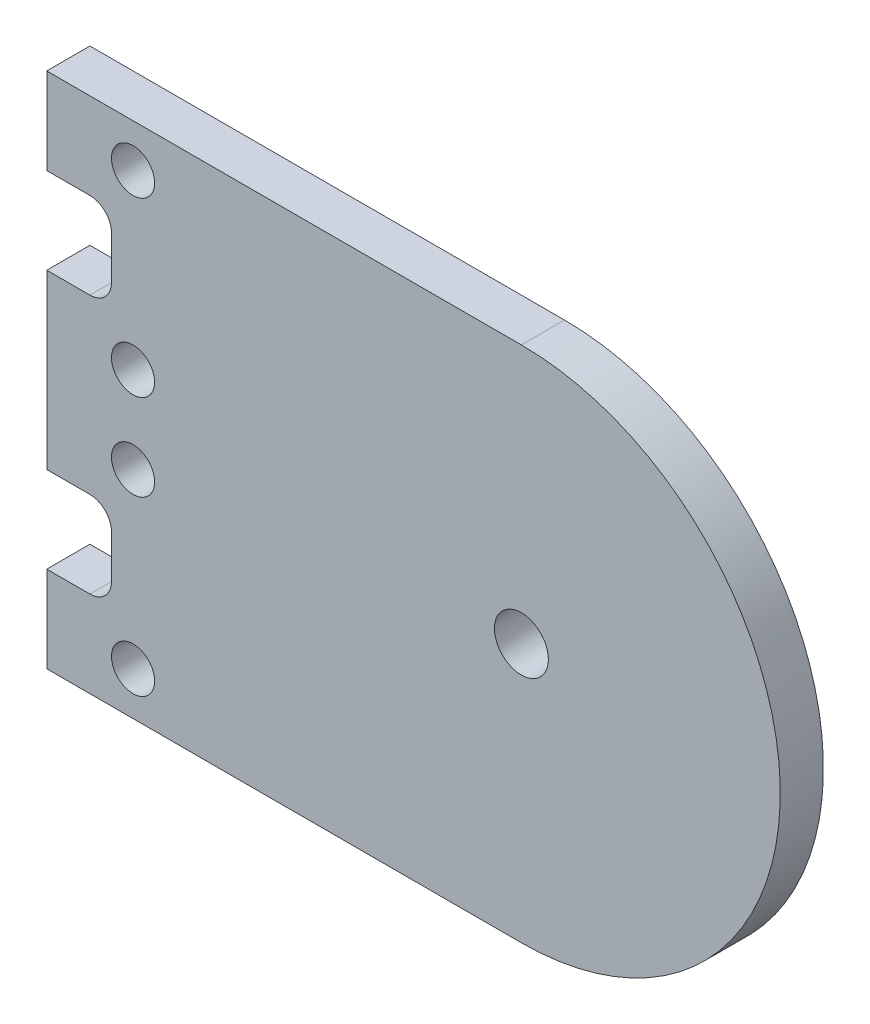
ISO-10303-21;
HEADER;
FILE_DESCRIPTION(('STEP AP214'),'2;1');
FILE_NAME('part.step','',(''),(''),'','','');
FILE_SCHEMA(('AUTOMOTIVE_DESIGN { 1 0 10303 214 1 1 1 1 }'));
ENDSEC;
DATA;
#1=APPLICATION_CONTEXT('core data for automotive mechanical design processes');
#2=APPLICATION_PROTOCOL_DEFINITION('international standard','automotive_design',2000,#1);
#3=PRODUCT_CONTEXT('',#1,'mechanical');
#4=PRODUCT('Part','Part','',(#3));
#5=PRODUCT_RELATED_PRODUCT_CATEGORY('part','',(#4));
#6=PRODUCT_DEFINITION_FORMATION('','',#4);
#7=PRODUCT_DEFINITION_CONTEXT('part definition',#1,'design');
#8=PRODUCT_DEFINITION('design','',#6,#7);
#9=PRODUCT_DEFINITION_SHAPE('','',#8);
#10=(LENGTH_UNIT() NAMED_UNIT(*) SI_UNIT(.MILLI.,.METRE.));
#11=(NAMED_UNIT(*) PLANE_ANGLE_UNIT() SI_UNIT($,.RADIAN.));
#12=(NAMED_UNIT(*) SI_UNIT($,.STERADIAN.) SOLID_ANGLE_UNIT());
#13=UNCERTAINTY_MEASURE_WITH_UNIT(LENGTH_MEASURE(1.E-05),#10,'distance_accuracy_value','');
#14=(GEOMETRIC_REPRESENTATION_CONTEXT(3) GLOBAL_UNCERTAINTY_ASSIGNED_CONTEXT((#13)) GLOBAL_UNIT_ASSIGNED_CONTEXT((#10,
#11,#12)) REPRESENTATION_CONTEXT('',''));
#15=CARTESIAN_POINT('',(0.,0.,0.));
#16=DIRECTION('',(0.,0.,1.));
#17=DIRECTION('',(1.,0.,0.));
#18=AXIS2_PLACEMENT_3D('',#15,#16,#17);
#19=CARTESIAN_POINT('',(-36.0930614932367,8.87902554185879,2.));
#20=DIRECTION('',(0.,0.,-1.));
#21=DIRECTION('',(-1.,0.,0.));
#22=AXIS2_PLACEMENT_3D('',#19,#20,#21);
#23=PLANE('',#22);
#24=DIRECTION('',(0.,-1.,0.));
#25=VECTOR('',#24,1.);
#26=CARTESIAN_POINT('',(-38.0930614932367,13.8790255418588,2.));
#27=LINE('',#26,#25);
#28=CARTESIAN_POINT('',(-38.0930614932367,13.8790255418588,2.));
#29=VERTEX_POINT('',#28);
#30=CARTESIAN_POINT('',(-38.0930614932367,9.87902554185879,2.));
#31=VERTEX_POINT('',#30);
#32=EDGE_CURVE('E208',#29,#31,#27,.T.);
#33=ORIENTED_EDGE('',*,*,#32,.T.);
#34=DIRECTION('',(1.,0.,0.));
#35=VECTOR('',#34,1.);
#36=CARTESIAN_POINT('',(-38.0930614932367,9.87902554185879,2.));
#37=LINE('',#36,#35);
#38=CARTESIAN_POINT('',(-36.0930614932367,9.87902554185879,2.));
#39=VERTEX_POINT('',#38);
#40=EDGE_CURVE('E116',#31,#39,#37,.T.);
#41=ORIENTED_EDGE('',*,*,#40,.T.);
#42=CARTESIAN_POINT('',(-36.0930614932367,8.87902554185879,2.));
#43=DIRECTION('',(0.,0.,-1.));
#44=DIRECTION('',(-1.,0.,0.));
#45=AXIS2_PLACEMENT_3D('',#42,#43,#44);
#46=CIRCLE('',#45,1.);
#47=CARTESIAN_POINT('',(-35.0930614932367,8.87902554185879,2.));
#48=VERTEX_POINT('',#47);
#49=EDGE_CURVE('E247',#39,#48,#46,.T.);
#50=ORIENTED_EDGE('',*,*,#49,.T.);
#51=DIRECTION('',(0.,-1.,0.));
#52=VECTOR('',#51,1.);
#53=CARTESIAN_POINT('',(-35.0930614932367,8.87902554185879,2.));
#54=LINE('',#53,#52);
#55=CARTESIAN_POINT('',(-35.0930614932367,6.87902554185879,2.));
#56=VERTEX_POINT('',#55);
#57=EDGE_CURVE('E266',#48,#56,#54,.T.);
#58=ORIENTED_EDGE('',*,*,#57,.T.);
#59=CARTESIAN_POINT('',(-36.0930614932367,6.87902554185879,2.));
#60=DIRECTION('',(0.,0.,-1.));
#61=DIRECTION('',(-1.,0.,0.));
#62=AXIS2_PLACEMENT_3D('',#59,#60,#61);
#63=CIRCLE('',#62,1.);
#64=CARTESIAN_POINT('',(-36.0930614932367,5.87902554185879,2.));
#65=VERTEX_POINT('',#64);
#66=EDGE_CURVE('E263',#56,#65,#63,.T.);
#67=ORIENTED_EDGE('',*,*,#66,.T.);
#68=DIRECTION('',(-1.,0.,0.));
#69=VECTOR('',#68,1.);
#70=CARTESIAN_POINT('',(-36.0930614932367,5.87902554185879,2.));
#71=LINE('',#70,#69);
#72=CARTESIAN_POINT('',(-38.0930614932367,5.87902554185879,2.));
#73=VERTEX_POINT('',#72);
#74=EDGE_CURVE('E265',#65,#73,#71,.T.);
#75=ORIENTED_EDGE('',*,*,#74,.T.);
#76=DIRECTION('',(0.,-1.,0.));
#77=VECTOR('',#76,1.);
#78=CARTESIAN_POINT('',(-38.0930614932367,5.87902554185879,2.));
#79=LINE('',#78,#77);
#80=CARTESIAN_POINT('',(-38.0930614932367,-2.12097445814121,2.));
#81=VERTEX_POINT('',#80);
#82=EDGE_CURVE('E268',#73,#81,#79,.T.);
#83=ORIENTED_EDGE('',*,*,#82,.T.);
#84=DIRECTION('',(1.,0.,0.));
#85=VECTOR('',#84,1.);
#86=CARTESIAN_POINT('',(-36.0930614932367,-2.12097445814121,2.));
#87=LINE('',#86,#85);
#88=CARTESIAN_POINT('',(-36.0930614932367,-2.12097445814121,2.));
#89=VERTEX_POINT('',#88);
#90=EDGE_CURVE('E274',#81,#89,#87,.T.);
#91=ORIENTED_EDGE('',*,*,#90,.T.);
#92=CARTESIAN_POINT('',(-36.0930614932367,-3.12097445814121,2.));
#93=DIRECTION('',(0.,0.,-1.));
#94=DIRECTION('',(1.,0.,0.));
#95=AXIS2_PLACEMENT_3D('',#92,#93,#94);
#96=CIRCLE('',#95,1.);
#97=CARTESIAN_POINT('',(-35.0930614932367,-3.12097445814121,2.));
#98=VERTEX_POINT('',#97);
#99=EDGE_CURVE('E276',#89,#98,#96,.T.);
#100=ORIENTED_EDGE('',*,*,#99,.T.);
#101=DIRECTION('',(0.,-1.,0.));
#102=VECTOR('',#101,1.);
#103=CARTESIAN_POINT('',(-35.0930614932367,-5.12097445814121,2.));
#104=LINE('',#103,#102);
#105=CARTESIAN_POINT('',(-35.0930614932367,-5.12097445814121,2.));
#106=VERTEX_POINT('',#105);
#107=EDGE_CURVE('E278',#98,#106,#104,.T.);
#108=ORIENTED_EDGE('',*,*,#107,.T.);
#109=CARTESIAN_POINT('',(-36.0930614932367,-5.12097445814121,2.));
#110=DIRECTION('',(0.,0.,-1.));
#111=DIRECTION('',(1.,0.,0.));
#112=AXIS2_PLACEMENT_3D('',#109,#110,#111);
#113=CIRCLE('',#112,1.);
#114=CARTESIAN_POINT('',(-36.0930614932367,-6.12097445814121,2.));
#115=VERTEX_POINT('',#114);
#116=EDGE_CURVE('E280',#106,#115,#113,.T.);
#117=ORIENTED_EDGE('',*,*,#116,.T.);
#118=DIRECTION('',(-1.,0.,0.));
#119=VECTOR('',#118,1.);
#120=CARTESIAN_POINT('',(-38.0930614932367,-6.12097445814121,2.));
#121=LINE('',#120,#119);
#122=CARTESIAN_POINT('',(-38.0930614932367,-6.12097445814121,2.));
#123=VERTEX_POINT('',#122);
#124=EDGE_CURVE('E282',#115,#123,#121,.T.);
#125=ORIENTED_EDGE('',*,*,#124,.T.);
#126=DIRECTION('',(0.,-1.,0.));
#127=VECTOR('',#126,1.);
#128=CARTESIAN_POINT('',(-38.0930614932367,-6.12097445814121,2.));
#129=LINE('',#128,#127);
#130=CARTESIAN_POINT('',(-38.0930614932367,-10.1209744581412,2.));
#131=VERTEX_POINT('',#130);
#132=EDGE_CURVE('E159',#123,#131,#129,.T.);
#133=ORIENTED_EDGE('',*,*,#132,.T.);
#134=DIRECTION('',(1.,0.,0.));
#135=VECTOR('',#134,1.);
#136=CARTESIAN_POINT('',(-38.0930614932367,-10.1209744581412,2.));
#137=LINE('',#136,#135);
#138=CARTESIAN_POINT('',(-16.0930614932367,-10.1209744581412,2.));
#139=VERTEX_POINT('',#138);
#140=EDGE_CURVE('E153',#131,#139,#137,.T.);
#141=ORIENTED_EDGE('',*,*,#140,.T.);
#142=CARTESIAN_POINT('',(-16.0930614932367,1.87902554185879,2.));
#143=DIRECTION('',(0.,0.,1.));
#144=DIRECTION('',(1.,0.,0.));
#145=AXIS2_PLACEMENT_3D('',#142,#143,#144);
#146=CIRCLE('',#145,12.);
#147=CARTESIAN_POINT('',(-16.0930614932367,13.8790255418588,2.));
#148=VERTEX_POINT('',#147);
#149=EDGE_CURVE('E157',#139,#148,#146,.T.);
#150=ORIENTED_EDGE('',*,*,#149,.T.);
#151=DIRECTION('',(-1.,0.,0.));
#152=VECTOR('',#151,1.);
#153=CARTESIAN_POINT('',(-38.0930614932367,13.8790255418588,2.));
#154=LINE('',#153,#152);
#155=EDGE_CURVE('E49',#148,#29,#154,.T.);
#156=ORIENTED_EDGE('',*,*,#155,.T.);
#157=EDGE_LOOP('',(#33,#41,#50,#58,#67,#75,#83,#91,#100,#108,#117,#125,#133,#141,#150,#156));
#158=FACE_BOUND('',#157,.T.);
#159=CARTESIAN_POINT('',(-16.0930614932367,1.87902554185879,2.));
#160=DIRECTION('',(0.,0.,1.));
#161=DIRECTION('',(1.,0.,0.));
#162=AXIS2_PLACEMENT_3D('',#159,#160,#161);
#163=CIRCLE('',#162,1.25);
#164=CARTESIAN_POINT('',(-14.8430614932367,1.87902554185879,2.));
#165=VERTEX_POINT('',#164);
#166=EDGE_CURVE('E181',#165,#165,#163,.T.);
#167=ORIENTED_EDGE('',*,*,#166,.F.);
#168=EDGE_LOOP('',(#167));
#169=FACE_BOUND('',#168,.T.);
#170=CARTESIAN_POINT('',(-34.0930614932367,11.8790255418588,2.));
#171=DIRECTION('',(0.,0.,1.));
#172=DIRECTION('',(1.,0.,0.));
#173=AXIS2_PLACEMENT_3D('',#170,#171,#172);
#174=CIRCLE('',#173,0.999999999999998);
#175=CARTESIAN_POINT('',(-33.0930614932367,11.8790255418588,2.));
#176=VERTEX_POINT('',#175);
#177=EDGE_CURVE('E356',#176,#176,#174,.T.);
#178=ORIENTED_EDGE('',*,*,#177,.F.);
#179=EDGE_LOOP('',(#178));
#180=FACE_BOUND('',#179,.T.);
#181=CARTESIAN_POINT('',(-34.0930614932367,3.87902554185879,2.));
#182=DIRECTION('',(0.,0.,1.));
#183=DIRECTION('',(1.,0.,0.));
#184=AXIS2_PLACEMENT_3D('',#181,#182,#183);
#185=CIRCLE('',#184,0.999999999999998);
#186=CARTESIAN_POINT('',(-33.0930614932367,3.87902554185879,2.));
#187=VERTEX_POINT('',#186);
#188=EDGE_CURVE('E350',#187,#187,#185,.T.);
#189=ORIENTED_EDGE('',*,*,#188,.F.);
#190=EDGE_LOOP('',(#189));
#191=FACE_BOUND('',#190,.T.);
#192=CARTESIAN_POINT('',(-34.0930614932367,-0.120974458141214,2.));
#193=DIRECTION('',(0.,0.,1.));
#194=DIRECTION('',(1.,0.,0.));
#195=AXIS2_PLACEMENT_3D('',#192,#193,#194);
#196=CIRCLE('',#195,0.999999999999998);
#197=CARTESIAN_POINT('',(-33.0930614932367,-0.120974458141214,2.));
#198=VERTEX_POINT('',#197);
#199=EDGE_CURVE('E344',#198,#198,#196,.T.);
#200=ORIENTED_EDGE('',*,*,#199,.F.);
#201=EDGE_LOOP('',(#200));
#202=FACE_BOUND('',#201,.T.);
#203=CARTESIAN_POINT('',(-34.0930614932367,-8.12097445814121,2.));
#204=DIRECTION('',(0.,0.,1.));
#205=DIRECTION('',(1.,0.,0.));
#206=AXIS2_PLACEMENT_3D('',#203,#204,#205);
#207=CIRCLE('',#206,0.999999999999998);
#208=CARTESIAN_POINT('',(-33.0930614932367,-8.12097445814121,2.));
#209=VERTEX_POINT('',#208);
#210=EDGE_CURVE('E335',#209,#209,#207,.T.);
#211=ORIENTED_EDGE('',*,*,#210,.F.);
#212=EDGE_LOOP('',(#211));
#213=FACE_BOUND('',#212,.T.);
#214=ADVANCED_FACE('F32',(#158,#169,#180,#191,#202,#213),#23,.F.);
#215=CARTESIAN_POINT('',(-36.0930614932367,8.87902554185879,0.));
#216=DIRECTION('',(0.,0.,-1.));
#217=DIRECTION('',(-1.,0.,0.));
#218=AXIS2_PLACEMENT_3D('',#215,#216,#217);
#219=PLANE('',#218);
#220=CARTESIAN_POINT('',(-34.0930614932367,-0.120974458141214,0.));
#221=DIRECTION('',(0.,0.,1.));
#222=DIRECTION('',(1.,0.,0.));
#223=AXIS2_PLACEMENT_3D('',#220,#221,#222);
#224=CIRCLE('',#223,0.999999999999998);
#225=CARTESIAN_POINT('',(-33.0930614932367,-0.120974458141214,0.));
#226=VERTEX_POINT('',#225);
#227=EDGE_CURVE('E341',#226,#226,#224,.T.);
#228=ORIENTED_EDGE('',*,*,#227,.T.);
#229=EDGE_LOOP('',(#228));
#230=FACE_BOUND('',#229,.T.);
#231=CARTESIAN_POINT('',(-34.0930614932367,11.8790255418588,0.));
#232=DIRECTION('',(0.,0.,1.));
#233=DIRECTION('',(1.,0.,0.));
#234=AXIS2_PLACEMENT_3D('',#231,#232,#233);
#235=CIRCLE('',#234,0.999999999999998);
#236=CARTESIAN_POINT('',(-33.0930614932367,11.8790255418588,0.));
#237=VERTEX_POINT('',#236);
#238=EDGE_CURVE('E353',#237,#237,#235,.T.);
#239=ORIENTED_EDGE('',*,*,#238,.T.);
#240=EDGE_LOOP('',(#239));
#241=FACE_BOUND('',#240,.T.);
#242=DIRECTION('',(0.,-1.,0.));
#243=VECTOR('',#242,1.);
#244=CARTESIAN_POINT('',(-38.0930614932367,13.8790255418588,0.));
#245=LINE('',#244,#243);
#246=CARTESIAN_POINT('',(-38.0930614932367,13.8790255418588,0.));
#247=VERTEX_POINT('',#246);
#248=CARTESIAN_POINT('',(-38.0930614932367,9.87902554185879,0.));
#249=VERTEX_POINT('',#248);
#250=EDGE_CURVE('E177',#247,#249,#245,.T.);
#251=ORIENTED_EDGE('',*,*,#250,.F.);
#252=DIRECTION('',(-1.,0.,0.));
#253=VECTOR('',#252,1.);
#254=CARTESIAN_POINT('',(-38.0930614932367,13.8790255418588,0.));
#255=LINE('',#254,#253);
#256=CARTESIAN_POINT('',(-16.0930614932367,13.8790255418588,0.));
#257=VERTEX_POINT('',#256);
#258=EDGE_CURVE('E108',#257,#247,#255,.T.);
#259=ORIENTED_EDGE('',*,*,#258,.F.);
#260=CARTESIAN_POINT('',(-16.0930614932367,1.87902554185879,0.));
#261=DIRECTION('',(0.,0.,1.));
#262=DIRECTION('',(1.,0.,0.));
#263=AXIS2_PLACEMENT_3D('',#260,#261,#262);
#264=CIRCLE('',#263,12.);
#265=CARTESIAN_POINT('',(-16.0930614932367,-10.1209744581412,0.));
#266=VERTEX_POINT('',#265);
#267=EDGE_CURVE('E102',#266,#257,#264,.T.);
#268=ORIENTED_EDGE('',*,*,#267,.F.);
#269=DIRECTION('',(1.,0.,0.));
#270=VECTOR('',#269,1.);
#271=CARTESIAN_POINT('',(-38.0930614932367,-10.1209744581412,0.));
#272=LINE('',#271,#270);
#273=CARTESIAN_POINT('',(-38.0930614932367,-10.1209744581412,0.));
#274=VERTEX_POINT('',#273);
#275=EDGE_CURVE('E167',#274,#266,#272,.T.);
#276=ORIENTED_EDGE('',*,*,#275,.F.);
#277=DIRECTION('',(0.,-1.,0.));
#278=VECTOR('',#277,1.);
#279=CARTESIAN_POINT('',(-38.0930614932367,-6.12097445814121,0.));
#280=LINE('',#279,#278);
#281=CARTESIAN_POINT('',(-38.0930614932367,-6.12097445814121,0.));
#282=VERTEX_POINT('',#281);
#283=EDGE_CURVE('E203',#282,#274,#280,.T.);
#284=ORIENTED_EDGE('',*,*,#283,.F.);
#285=DIRECTION('',(-1.,0.,0.));
#286=VECTOR('',#285,1.);
#287=CARTESIAN_POINT('',(-38.0930614932367,-6.12097445814121,0.));
#288=LINE('',#287,#286);
#289=CARTESIAN_POINT('',(-36.0930614932367,-6.12097445814121,0.));
#290=VERTEX_POINT('',#289);
#291=EDGE_CURVE('E201',#290,#282,#288,.T.);
#292=ORIENTED_EDGE('',*,*,#291,.F.);
#293=CARTESIAN_POINT('',(-36.0930614932367,-5.12097445814121,0.));
#294=DIRECTION('',(0.,0.,-1.));
#295=DIRECTION('',(1.,0.,0.));
#296=AXIS2_PLACEMENT_3D('',#293,#294,#295);
#297=CIRCLE('',#296,1.);
#298=CARTESIAN_POINT('',(-35.0930614932367,-5.12097445814121,0.));
#299=VERTEX_POINT('',#298);
#300=EDGE_CURVE('E199',#299,#290,#297,.T.);
#301=ORIENTED_EDGE('',*,*,#300,.F.);
#302=DIRECTION('',(0.,-1.,0.));
#303=VECTOR('',#302,1.);
#304=CARTESIAN_POINT('',(-35.0930614932367,-5.12097445814121,0.));
#305=LINE('',#304,#303);
#306=CARTESIAN_POINT('',(-35.0930614932367,-3.12097445814121,0.));
#307=VERTEX_POINT('',#306);
#308=EDGE_CURVE('E197',#307,#299,#305,.T.);
#309=ORIENTED_EDGE('',*,*,#308,.F.);
#310=CARTESIAN_POINT('',(-36.0930614932367,-3.12097445814121,0.));
#311=DIRECTION('',(0.,0.,-1.));
#312=DIRECTION('',(1.,0.,0.));
#313=AXIS2_PLACEMENT_3D('',#310,#311,#312);
#314=CIRCLE('',#313,1.);
#315=CARTESIAN_POINT('',(-36.0930614932367,-2.12097445814121,0.));
#316=VERTEX_POINT('',#315);
#317=EDGE_CURVE('E195',#316,#307,#314,.T.);
#318=ORIENTED_EDGE('',*,*,#317,.F.);
#319=DIRECTION('',(1.,0.,0.));
#320=VECTOR('',#319,1.);
#321=CARTESIAN_POINT('',(-36.0930614932367,-2.12097445814121,0.));
#322=LINE('',#321,#320);
#323=CARTESIAN_POINT('',(-38.0930614932367,-2.12097445814121,0.));
#324=VERTEX_POINT('',#323);
#325=EDGE_CURVE('E193',#324,#316,#322,.T.);
#326=ORIENTED_EDGE('',*,*,#325,.F.);
#327=DIRECTION('',(0.,-1.,0.));
#328=VECTOR('',#327,1.);
#329=CARTESIAN_POINT('',(-38.0930614932367,5.87902554185879,0.));
#330=LINE('',#329,#328);
#331=CARTESIAN_POINT('',(-38.0930614932367,5.87902554185879,0.));
#332=VERTEX_POINT('',#331);
#333=EDGE_CURVE('E191',#332,#324,#330,.T.);
#334=ORIENTED_EDGE('',*,*,#333,.F.);
#335=DIRECTION('',(-1.,0.,0.));
#336=VECTOR('',#335,1.);
#337=CARTESIAN_POINT('',(-36.0930614932367,5.87902554185879,0.));
#338=LINE('',#337,#336);
#339=CARTESIAN_POINT('',(-36.0930614932367,5.87902554185879,0.));
#340=VERTEX_POINT('',#339);
#341=EDGE_CURVE('E189',#340,#332,#338,.T.);
#342=ORIENTED_EDGE('',*,*,#341,.F.);
#343=CARTESIAN_POINT('',(-36.0930614932367,6.87902554185879,0.));
#344=DIRECTION('',(0.,0.,-1.));
#345=DIRECTION('',(-1.,0.,0.));
#346=AXIS2_PLACEMENT_3D('',#343,#344,#345);
#347=CIRCLE('',#346,1.);
#348=CARTESIAN_POINT('',(-35.0930614932367,6.87902554185879,0.));
#349=VERTEX_POINT('',#348);
#350=EDGE_CURVE('E187',#349,#340,#347,.T.);
#351=ORIENTED_EDGE('',*,*,#350,.F.);
#352=DIRECTION('',(0.,-1.,0.));
#353=VECTOR('',#352,1.);
#354=CARTESIAN_POINT('',(-35.0930614932367,8.87902554185879,0.));
#355=LINE('',#354,#353);
#356=CARTESIAN_POINT('',(-35.0930614932367,8.87902554185879,0.));
#357=VERTEX_POINT('',#356);
#358=EDGE_CURVE('E185',#357,#349,#355,.T.);
#359=ORIENTED_EDGE('',*,*,#358,.F.);
#360=CARTESIAN_POINT('',(-36.0930614932367,8.87902554185879,0.));
#361=DIRECTION('',(0.,0.,-1.));
#362=DIRECTION('',(-1.,0.,0.));
#363=AXIS2_PLACEMENT_3D('',#360,#361,#362);
#364=CIRCLE('',#363,1.);
#365=CARTESIAN_POINT('',(-36.0930614932367,9.87902554185879,0.));
#366=VERTEX_POINT('',#365);
#367=EDGE_CURVE('E183',#366,#357,#364,.T.);
#368=ORIENTED_EDGE('',*,*,#367,.F.);
#369=DIRECTION('',(1.,0.,0.));
#370=VECTOR('',#369,1.);
#371=CARTESIAN_POINT('',(-38.0930614932367,9.87902554185879,0.));
#372=LINE('',#371,#370);
#373=EDGE_CURVE('E180',#249,#366,#372,.T.);
#374=ORIENTED_EDGE('',*,*,#373,.F.);
#375=EDGE_LOOP('',(#251,#259,#268,#276,#284,#292,#301,#309,#318,#326,#334,#342,#351,#359,#368,#374));
#376=FACE_BOUND('',#375,.T.);
#377=CARTESIAN_POINT('',(-16.0930614932367,1.87902554185879,0.));
#378=DIRECTION('',(0.,0.,1.));
#379=DIRECTION('',(1.,0.,0.));
#380=AXIS2_PLACEMENT_3D('',#377,#378,#379);
#381=CIRCLE('',#380,1.25);
#382=CARTESIAN_POINT('',(-14.8430614932367,1.87902554185879,0.));
#383=VERTEX_POINT('',#382);
#384=EDGE_CURVE('E359',#383,#383,#381,.T.);
#385=ORIENTED_EDGE('',*,*,#384,.T.);
#386=EDGE_LOOP('',(#385));
#387=FACE_BOUND('',#386,.T.);
#388=CARTESIAN_POINT('',(-34.0930614932367,3.87902554185879,0.));
#389=DIRECTION('',(0.,0.,1.));
#390=DIRECTION('',(1.,0.,0.));
#391=AXIS2_PLACEMENT_3D('',#388,#389,#390);
#392=CIRCLE('',#391,0.999999999999998);
#393=CARTESIAN_POINT('',(-33.0930614932367,3.87902554185879,0.));
#394=VERTEX_POINT('',#393);
#395=EDGE_CURVE('E347',#394,#394,#392,.T.);
#396=ORIENTED_EDGE('',*,*,#395,.T.);
#397=EDGE_LOOP('',(#396));
#398=FACE_BOUND('',#397,.T.);
#399=CARTESIAN_POINT('',(-34.0930614932367,-8.12097445814121,0.));
#400=DIRECTION('',(0.,0.,1.));
#401=DIRECTION('',(1.,0.,0.));
#402=AXIS2_PLACEMENT_3D('',#399,#400,#401);
#403=CIRCLE('',#402,0.999999999999998);
#404=CARTESIAN_POINT('',(-33.0930614932367,-8.12097445814121,0.));
#405=VERTEX_POINT('',#404);
#406=EDGE_CURVE('E338',#405,#405,#403,.T.);
#407=ORIENTED_EDGE('',*,*,#406,.T.);
#408=EDGE_LOOP('',(#407));
#409=FACE_BOUND('',#408,.T.);
#410=ADVANCED_FACE('F251',(#230,#241,#376,#387,#398,#409),#219,.T.);
#411=CARTESIAN_POINT('',(-38.0930614932367,13.8790255418588,2.));
#412=DIRECTION('',(1.,0.,0.));
#413=DIRECTION('',(0.,0.,-1.));
#414=AXIS2_PLACEMENT_3D('',#411,#412,#413);
#415=PLANE('',#414);
#416=ORIENTED_EDGE('',*,*,#250,.T.);
#417=DIRECTION('',(0.,0.,-1.));
#418=VECTOR('',#417,1.);
#419=CARTESIAN_POINT('',(-38.0930614932367,9.87902554185879,2.));
#420=LINE('',#419,#418);
#421=EDGE_CURVE('E11',#31,#249,#420,.T.);
#422=ORIENTED_EDGE('',*,*,#421,.F.);
#423=ORIENTED_EDGE('',*,*,#32,.F.);
#424=DIRECTION('',(0.,0.,-1.));
#425=VECTOR('',#424,1.);
#426=CARTESIAN_POINT('',(-38.0930614932367,13.8790255418588,2.));
#427=LINE('',#426,#425);
#428=EDGE_CURVE('E173',#29,#247,#427,.T.);
#429=ORIENTED_EDGE('',*,*,#428,.T.);
#430=EDGE_LOOP('',(#416,#422,#423,#429));
#431=FACE_BOUND('',#430,.T.);
#432=ADVANCED_FACE('F34',(#431),#415,.F.);
#433=CARTESIAN_POINT('',(-38.0930614932367,9.87902554185879,2.));
#434=DIRECTION('',(0.,1.,0.));
#435=DIRECTION('',(0.,0.,1.));
#436=AXIS2_PLACEMENT_3D('',#433,#434,#435);
#437=PLANE('',#436);
#438=ORIENTED_EDGE('',*,*,#373,.T.);
#439=DIRECTION('',(0.,0.,-1.));
#440=VECTOR('',#439,1.);
#441=CARTESIAN_POINT('',(-36.0930614932367,9.87902554185879,2.));
#442=LINE('',#441,#440);
#443=EDGE_CURVE('E41',#39,#366,#442,.T.);
#444=ORIENTED_EDGE('',*,*,#443,.F.);
#445=ORIENTED_EDGE('',*,*,#40,.F.);
#446=ORIENTED_EDGE('',*,*,#421,.T.);
#447=EDGE_LOOP('',(#438,#444,#445,#446));
#448=FACE_BOUND('',#447,.T.);
#449=ADVANCED_FACE('F520',(#448),#437,.F.);
#450=CARTESIAN_POINT('',(-36.0930614932367,8.87902554185879,2.));
#451=DIRECTION('',(0.,0.,-1.));
#452=DIRECTION('',(-1.,0.,0.));
#453=AXIS2_PLACEMENT_3D('',#450,#451,#452);
#454=CYLINDRICAL_SURFACE('',#453,1.);
#455=ORIENTED_EDGE('',*,*,#367,.T.);
#456=DIRECTION('',(0.,0.,-1.));
#457=VECTOR('',#456,1.);
#458=CARTESIAN_POINT('',(-35.0930614932367,8.87902554185879,2.));
#459=LINE('',#458,#457);
#460=EDGE_CURVE('E239',#48,#357,#459,.T.);
#461=ORIENTED_EDGE('',*,*,#460,.F.);
#462=ORIENTED_EDGE('',*,*,#49,.F.);
#463=ORIENTED_EDGE('',*,*,#443,.T.);
#464=EDGE_LOOP('',(#455,#461,#462,#463));
#465=FACE_BOUND('',#464,.T.);
#466=ADVANCED_FACE('F245',(#465),#454,.F.);
#467=CARTESIAN_POINT('',(-35.0930614932367,8.87902554185879,2.));
#468=DIRECTION('',(1.,0.,0.));
#469=DIRECTION('',(0.,0.,-1.));
#470=AXIS2_PLACEMENT_3D('',#467,#468,#469);
#471=PLANE('',#470);
#472=ORIENTED_EDGE('',*,*,#358,.T.);
#473=DIRECTION('',(0.,0.,-1.));
#474=VECTOR('',#473,1.);
#475=CARTESIAN_POINT('',(-35.0930614932367,6.87902554185879,2.));
#476=LINE('',#475,#474);
#477=EDGE_CURVE('E236',#56,#349,#476,.T.);
#478=ORIENTED_EDGE('',*,*,#477,.F.);
#479=ORIENTED_EDGE('',*,*,#57,.F.);
#480=ORIENTED_EDGE('',*,*,#460,.T.);
#481=EDGE_LOOP('',(#472,#478,#479,#480));
#482=FACE_BOUND('',#481,.T.);
#483=ADVANCED_FACE('F257',(#482),#471,.F.);
#484=CARTESIAN_POINT('',(-36.0930614932367,6.87902554185879,2.));
#485=DIRECTION('',(0.,0.,-1.));
#486=DIRECTION('',(-1.,0.,0.));
#487=AXIS2_PLACEMENT_3D('',#484,#485,#486);
#488=CYLINDRICAL_SURFACE('',#487,1.);
#489=ORIENTED_EDGE('',*,*,#350,.T.);
#490=DIRECTION('',(0.,0.,-1.));
#491=VECTOR('',#490,1.);
#492=CARTESIAN_POINT('',(-36.0930614932367,5.87902554185879,2.));
#493=LINE('',#492,#491);
#494=EDGE_CURVE('E233',#65,#340,#493,.T.);
#495=ORIENTED_EDGE('',*,*,#494,.F.);
#496=ORIENTED_EDGE('',*,*,#66,.F.);
#497=ORIENTED_EDGE('',*,*,#477,.T.);
#498=EDGE_LOOP('',(#489,#495,#496,#497));
#499=FACE_BOUND('',#498,.T.);
#500=ADVANCED_FACE('F261',(#499),#488,.F.);
#501=CARTESIAN_POINT('',(-36.0930614932367,5.87902554185879,2.));
#502=DIRECTION('',(0.,-1.,0.));
#503=DIRECTION('',(0.,0.,-1.));
#504=AXIS2_PLACEMENT_3D('',#501,#502,#503);
#505=PLANE('',#504);
#506=ORIENTED_EDGE('',*,*,#341,.T.);
#507=DIRECTION('',(0.,0.,-1.));
#508=VECTOR('',#507,1.);
#509=CARTESIAN_POINT('',(-38.0930614932367,5.87902554185879,2.));
#510=LINE('',#509,#508);
#511=EDGE_CURVE('E230',#73,#332,#510,.T.);
#512=ORIENTED_EDGE('',*,*,#511,.F.);
#513=ORIENTED_EDGE('',*,*,#74,.F.);
#514=ORIENTED_EDGE('',*,*,#494,.T.);
#515=EDGE_LOOP('',(#506,#512,#513,#514));
#516=FACE_BOUND('',#515,.T.);
#517=ADVANCED_FACE('F485',(#516),#505,.F.);
#518=CARTESIAN_POINT('',(-38.0930614932367,5.87902554185879,2.));
#519=DIRECTION('',(1.,0.,0.));
#520=DIRECTION('',(0.,0.,-1.));
#521=AXIS2_PLACEMENT_3D('',#518,#519,#520);
#522=PLANE('',#521);
#523=ORIENTED_EDGE('',*,*,#333,.T.);
#524=DIRECTION('',(0.,0.,-1.));
#525=VECTOR('',#524,1.);
#526=CARTESIAN_POINT('',(-38.0930614932367,-2.12097445814121,2.));
#527=LINE('',#526,#525);
#528=EDGE_CURVE('E227',#81,#324,#527,.T.);
#529=ORIENTED_EDGE('',*,*,#528,.F.);
#530=ORIENTED_EDGE('',*,*,#82,.F.);
#531=ORIENTED_EDGE('',*,*,#511,.T.);
#532=EDGE_LOOP('',(#523,#529,#530,#531));
#533=FACE_BOUND('',#532,.T.);
#534=ADVANCED_FACE('F475',(#533),#522,.F.);
#535=CARTESIAN_POINT('',(-36.0930614932367,-2.12097445814121,2.));
#536=DIRECTION('',(0.,1.,0.));
#537=DIRECTION('',(0.,0.,1.));
#538=AXIS2_PLACEMENT_3D('',#535,#536,#537);
#539=PLANE('',#538);
#540=ORIENTED_EDGE('',*,*,#325,.T.);
#541=DIRECTION('',(0.,0.,-1.));
#542=VECTOR('',#541,1.);
#543=CARTESIAN_POINT('',(-36.0930614932367,-2.12097445814121,2.));
#544=LINE('',#543,#542);
#545=EDGE_CURVE('E224',#89,#316,#544,.T.);
#546=ORIENTED_EDGE('',*,*,#545,.F.);
#547=ORIENTED_EDGE('',*,*,#90,.F.);
#548=ORIENTED_EDGE('',*,*,#528,.T.);
#549=EDGE_LOOP('',(#540,#546,#547,#548));
#550=FACE_BOUND('',#549,.T.);
#551=ADVANCED_FACE('F465',(#550),#539,.F.);
#552=CARTESIAN_POINT('',(-36.0930614932367,-3.12097445814121,2.));
#553=DIRECTION('',(0.,0.,-1.));
#554=DIRECTION('',(-1.,0.,0.));
#555=AXIS2_PLACEMENT_3D('',#552,#553,#554);
#556=CYLINDRICAL_SURFACE('',#555,1.);
#557=ORIENTED_EDGE('',*,*,#317,.T.);
#558=DIRECTION('',(0.,0.,-1.));
#559=VECTOR('',#558,1.);
#560=CARTESIAN_POINT('',(-35.0930614932367,-3.12097445814121,2.));
#561=LINE('',#560,#559);
#562=EDGE_CURVE('E221',#98,#307,#561,.T.);
#563=ORIENTED_EDGE('',*,*,#562,.F.);
#564=ORIENTED_EDGE('',*,*,#99,.F.);
#565=ORIENTED_EDGE('',*,*,#545,.T.);
#566=EDGE_LOOP('',(#557,#563,#564,#565));
#567=FACE_BOUND('',#566,.T.);
#568=ADVANCED_FACE('F455',(#567),#556,.F.);
#569=CARTESIAN_POINT('',(-35.0930614932367,-5.12097445814121,2.));
#570=DIRECTION('',(1.,0.,0.));
#571=DIRECTION('',(0.,0.,-1.));
#572=AXIS2_PLACEMENT_3D('',#569,#570,#571);
#573=PLANE('',#572);
#574=ORIENTED_EDGE('',*,*,#308,.T.);
#575=DIRECTION('',(0.,0.,-1.));
#576=VECTOR('',#575,1.);
#577=CARTESIAN_POINT('',(-35.0930614932367,-5.12097445814121,2.));
#578=LINE('',#577,#576);
#579=EDGE_CURVE('E218',#106,#299,#578,.T.);
#580=ORIENTED_EDGE('',*,*,#579,.F.);
#581=ORIENTED_EDGE('',*,*,#107,.F.);
#582=ORIENTED_EDGE('',*,*,#562,.T.);
#583=EDGE_LOOP('',(#574,#580,#581,#582));
#584=FACE_BOUND('',#583,.T.);
#585=ADVANCED_FACE('F445',(#584),#573,.F.);
#586=CARTESIAN_POINT('',(-36.0930614932367,-5.12097445814121,2.));
#587=DIRECTION('',(0.,0.,-1.));
#588=DIRECTION('',(-1.,0.,0.));
#589=AXIS2_PLACEMENT_3D('',#586,#587,#588);
#590=CYLINDRICAL_SURFACE('',#589,1.);
#591=ORIENTED_EDGE('',*,*,#300,.T.);
#592=DIRECTION('',(0.,0.,-1.));
#593=VECTOR('',#592,1.);
#594=CARTESIAN_POINT('',(-36.0930614932367,-6.12097445814121,2.));
#595=LINE('',#594,#593);
#596=EDGE_CURVE('E215',#115,#290,#595,.T.);
#597=ORIENTED_EDGE('',*,*,#596,.F.);
#598=ORIENTED_EDGE('',*,*,#116,.F.);
#599=ORIENTED_EDGE('',*,*,#579,.T.);
#600=EDGE_LOOP('',(#591,#597,#598,#599));
#601=FACE_BOUND('',#600,.T.);
#602=ADVANCED_FACE('F436',(#601),#590,.F.);
#603=CARTESIAN_POINT('',(-38.0930614932367,-6.12097445814121,2.));
#604=DIRECTION('',(0.,-1.,0.));
#605=DIRECTION('',(0.,0.,-1.));
#606=AXIS2_PLACEMENT_3D('',#603,#604,#605);
#607=PLANE('',#606);
#608=ORIENTED_EDGE('',*,*,#291,.T.);
#609=DIRECTION('',(0.,0.,-1.));
#610=VECTOR('',#609,1.);
#611=CARTESIAN_POINT('',(-38.0930614932367,-6.12097445814121,2.));
#612=LINE('',#611,#610);
#613=EDGE_CURVE('E212',#123,#282,#612,.T.);
#614=ORIENTED_EDGE('',*,*,#613,.F.);
#615=ORIENTED_EDGE('',*,*,#124,.F.);
#616=ORIENTED_EDGE('',*,*,#596,.T.);
#617=EDGE_LOOP('',(#608,#614,#615,#616));
#618=FACE_BOUND('',#617,.T.);
#619=ADVANCED_FACE('F288',(#618),#607,.F.);
#620=CARTESIAN_POINT('',(-38.0930614932367,-6.12097445814121,2.));
#621=DIRECTION('',(1.,0.,0.));
#622=DIRECTION('',(0.,0.,-1.));
#623=AXIS2_PLACEMENT_3D('',#620,#621,#622);
#624=PLANE('',#623);
#625=ORIENTED_EDGE('',*,*,#283,.T.);
#626=DIRECTION('',(0.,0.,-1.));
#627=VECTOR('',#626,1.);
#628=CARTESIAN_POINT('',(-38.0930614932367,-10.1209744581412,2.));
#629=LINE('',#628,#627);
#630=EDGE_CURVE('E168',#131,#274,#629,.T.);
#631=ORIENTED_EDGE('',*,*,#630,.F.);
#632=ORIENTED_EDGE('',*,*,#132,.F.);
#633=ORIENTED_EDGE('',*,*,#613,.T.);
#634=EDGE_LOOP('',(#625,#631,#632,#633));
#635=FACE_BOUND('',#634,.T.);
#636=ADVANCED_FACE('F292',(#635),#624,.F.);
#637=CARTESIAN_POINT('',(-38.0930614932367,-10.1209744581412,2.));
#638=DIRECTION('',(0.,1.,0.));
#639=DIRECTION('',(-1.,0.,0.));
#640=AXIS2_PLACEMENT_3D('',#637,#638,#639);
#641=PLANE('',#640);
#642=ORIENTED_EDGE('',*,*,#275,.T.);
#643=DIRECTION('',(0.,0.,-1.));
#644=VECTOR('',#643,1.);
#645=CARTESIAN_POINT('',(-16.0930614932367,-10.1209744581412,2.));
#646=LINE('',#645,#644);
#647=EDGE_CURVE('E164',#139,#266,#646,.T.);
#648=ORIENTED_EDGE('',*,*,#647,.F.);
#649=ORIENTED_EDGE('',*,*,#140,.F.);
#650=ORIENTED_EDGE('',*,*,#630,.T.);
#651=EDGE_LOOP('',(#642,#648,#649,#650));
#652=FACE_BOUND('',#651,.T.);
#653=ADVANCED_FACE('F165',(#652),#641,.F.);
#654=CARTESIAN_POINT('',(-16.0930614932367,1.87902554185879,2.));
#655=DIRECTION('',(0.,0.,-1.));
#656=DIRECTION('',(-1.,0.,0.));
#657=AXIS2_PLACEMENT_3D('',#654,#655,#656);
#658=CYLINDRICAL_SURFACE('',#657,12.);
#659=ORIENTED_EDGE('',*,*,#267,.T.);
#660=DIRECTION('',(0.,0.,-1.));
#661=VECTOR('',#660,1.);
#662=CARTESIAN_POINT('',(-16.0930614932367,13.8790255418588,2.));
#663=LINE('',#662,#661);
#664=EDGE_CURVE('E169',#148,#257,#663,.T.);
#665=ORIENTED_EDGE('',*,*,#664,.F.);
#666=ORIENTED_EDGE('',*,*,#149,.F.);
#667=ORIENTED_EDGE('',*,*,#647,.T.);
#668=EDGE_LOOP('',(#659,#665,#666,#667));
#669=FACE_BOUND('',#668,.T.);
#670=ADVANCED_FACE('F171',(#669),#658,.T.);
#671=CARTESIAN_POINT('',(-38.0930614932367,13.8790255418588,2.));
#672=DIRECTION('',(0.,-1.,0.));
#673=DIRECTION('',(0.,0.,-1.));
#674=AXIS2_PLACEMENT_3D('',#671,#672,#673);
#675=PLANE('',#674);
#676=ORIENTED_EDGE('',*,*,#258,.T.);
#677=ORIENTED_EDGE('',*,*,#428,.F.);
#678=ORIENTED_EDGE('',*,*,#155,.F.);
#679=ORIENTED_EDGE('',*,*,#664,.T.);
#680=EDGE_LOOP('',(#676,#677,#678,#679));
#681=FACE_BOUND('',#680,.T.);
#682=ADVANCED_FACE('F296',(#681),#675,.F.);
#683=CARTESIAN_POINT('',(-16.0930614932367,1.87902554185879,2.));
#684=DIRECTION('',(0.,0.,-1.));
#685=DIRECTION('',(-1.,0.,0.));
#686=AXIS2_PLACEMENT_3D('',#683,#684,#685);
#687=CYLINDRICAL_SURFACE('',#686,1.25);
#688=ORIENTED_EDGE('',*,*,#166,.T.);
#689=EDGE_LOOP('',(#688));
#690=FACE_BOUND('',#689,.T.);
#691=ORIENTED_EDGE('',*,*,#384,.F.);
#692=EDGE_LOOP('',(#691));
#693=FACE_BOUND('',#692,.T.);
#694=ADVANCED_FACE('F298',(#690,#693),#687,.F.);
#695=CARTESIAN_POINT('',(-34.0930614932367,11.8790255418588,2.));
#696=DIRECTION('',(0.,0.,-1.));
#697=DIRECTION('',(-1.,0.,0.));
#698=AXIS2_PLACEMENT_3D('',#695,#696,#697);
#699=CYLINDRICAL_SURFACE('',#698,0.999999999999998);
#700=ORIENTED_EDGE('',*,*,#177,.T.);
#701=EDGE_LOOP('',(#700));
#702=FACE_BOUND('',#701,.T.);
#703=ORIENTED_EDGE('',*,*,#238,.F.);
#704=EDGE_LOOP('',(#703));
#705=FACE_BOUND('',#704,.T.);
#706=ADVANCED_FACE('F304',(#702,#705),#699,.F.);
#707=CARTESIAN_POINT('',(-34.0930614932367,3.87902554185879,2.));
#708=DIRECTION('',(0.,0.,-1.));
#709=DIRECTION('',(-1.,0.,0.));
#710=AXIS2_PLACEMENT_3D('',#707,#708,#709);
#711=CYLINDRICAL_SURFACE('',#710,0.999999999999998);
#712=ORIENTED_EDGE('',*,*,#188,.T.);
#713=EDGE_LOOP('',(#712));
#714=FACE_BOUND('',#713,.T.);
#715=ORIENTED_EDGE('',*,*,#395,.F.);
#716=EDGE_LOOP('',(#715));
#717=FACE_BOUND('',#716,.T.);
#718=ADVANCED_FACE('F318',(#714,#717),#711,.F.);
#719=CARTESIAN_POINT('',(-34.0930614932367,-0.120974458141214,2.));
#720=DIRECTION('',(0.,0.,-1.));
#721=DIRECTION('',(-1.,0.,0.));
#722=AXIS2_PLACEMENT_3D('',#719,#720,#721);
#723=CYLINDRICAL_SURFACE('',#722,0.999999999999998);
#724=ORIENTED_EDGE('',*,*,#199,.T.);
#725=EDGE_LOOP('',(#724));
#726=FACE_BOUND('',#725,.T.);
#727=ORIENTED_EDGE('',*,*,#227,.F.);
#728=EDGE_LOOP('',(#727));
#729=FACE_BOUND('',#728,.T.);
#730=ADVANCED_FACE('F322',(#726,#729),#723,.F.);
#731=CARTESIAN_POINT('',(-34.0930614932367,-8.12097445814121,2.));
#732=DIRECTION('',(0.,0.,-1.));
#733=DIRECTION('',(-1.,0.,0.));
#734=AXIS2_PLACEMENT_3D('',#731,#732,#733);
#735=CYLINDRICAL_SURFACE('',#734,0.999999999999998);
#736=ORIENTED_EDGE('',*,*,#210,.T.);
#737=EDGE_LOOP('',(#736));
#738=FACE_BOUND('',#737,.T.);
#739=ORIENTED_EDGE('',*,*,#406,.F.);
#740=EDGE_LOOP('',(#739));
#741=FACE_BOUND('',#740,.T.);
#742=ADVANCED_FACE('F326',(#738,#741),#735,.F.);
#743=CLOSED_SHELL('',(#214,#410,#432,#449,#466,#483,#500,#517,#534,#551,#568,#585,#602,#619,
#636,#653,#670,#682,#694,#706,#718,#730,#742));
#744=MANIFOLD_SOLID_BREP('B2',#743);
#745=ADVANCED_BREP_SHAPE_REPRESENTATION('',(#18,#744),#14);
#746=SHAPE_DEFINITION_REPRESENTATION(#9,#745);
ENDSEC;
END-ISO-10303-21;
